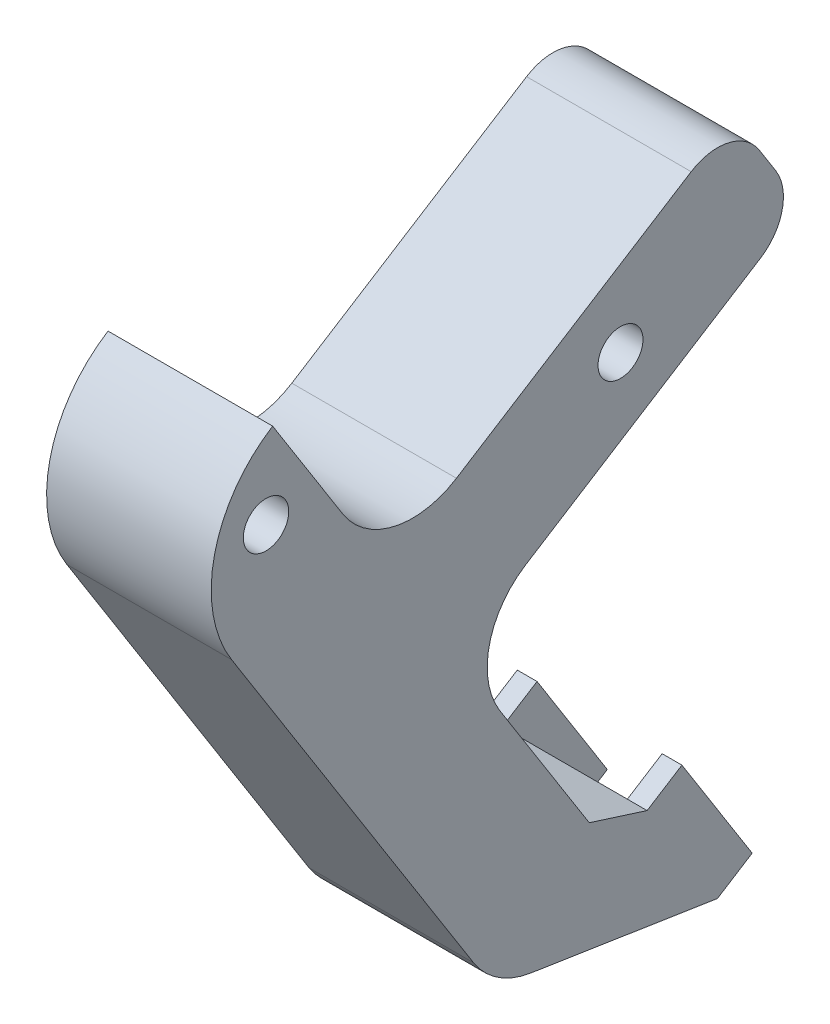
ISO-10303-21;
HEADER;
FILE_DESCRIPTION(('STEP AP214'),'2;1');
FILE_NAME('part.step','',(''),(''),'','','');
FILE_SCHEMA(('AUTOMOTIVE_DESIGN { 1 0 10303 214 1 1 1 1 }'));
ENDSEC;
DATA;
#1=APPLICATION_CONTEXT('core data for automotive mechanical design processes');
#2=APPLICATION_PROTOCOL_DEFINITION('international standard','automotive_design',2000,#1);
#3=PRODUCT_CONTEXT('',#1,'mechanical');
#4=PRODUCT('Part','Part','',(#3));
#5=PRODUCT_RELATED_PRODUCT_CATEGORY('part','',(#4));
#6=PRODUCT_DEFINITION_FORMATION('','',#4);
#7=PRODUCT_DEFINITION_CONTEXT('part definition',#1,'design');
#8=PRODUCT_DEFINITION('design','',#6,#7);
#9=PRODUCT_DEFINITION_SHAPE('','',#8);
#10=(LENGTH_UNIT() NAMED_UNIT(*) SI_UNIT(.MILLI.,.METRE.));
#11=(NAMED_UNIT(*) PLANE_ANGLE_UNIT() SI_UNIT($,.RADIAN.));
#12=(NAMED_UNIT(*) SI_UNIT($,.STERADIAN.) SOLID_ANGLE_UNIT());
#13=UNCERTAINTY_MEASURE_WITH_UNIT(LENGTH_MEASURE(1.E-05),#10,'distance_accuracy_value','');
#14=(GEOMETRIC_REPRESENTATION_CONTEXT(3) GLOBAL_UNCERTAINTY_ASSIGNED_CONTEXT((#13)) GLOBAL_UNIT_ASSIGNED_CONTEXT((#10,
#11,#12)) REPRESENTATION_CONTEXT('',''));
#15=CARTESIAN_POINT('',(0.,0.,0.));
#16=DIRECTION('',(0.,0.,1.));
#17=DIRECTION('',(1.,0.,0.));
#18=AXIS2_PLACEMENT_3D('',#15,#16,#17);
#19=CARTESIAN_POINT('',(-6.35000000000044,13860.4244470789,11803.2346085107));
#20=DIRECTION('',(0.,0.533629298072643,-0.845718494676862));
#21=DIRECTION('',(0.,0.845718494676863,0.533629298072643));
#22=AXIS2_PLACEMENT_3D('',#19,#20,#21);
#23=PLANE('',#22);
#24=DIRECTION('',(1.,0.,0.));
#25=VECTOR('',#24,1.);
#26=CARTESIAN_POINT('',(-6.35000000000044,13851.8319471729,11797.8129348422));
#27=LINE('',#26,#25);
#28=CARTESIAN_POINT('',(-4.82600000000044,13851.8319471729,11797.8129348422));
#29=VERTEX_POINT('',#28);
#30=CARTESIAN_POINT('',(4.8259999999995,13851.8319471729,11797.8129348422));
#31=VERTEX_POINT('',#30);
#32=EDGE_CURVE('E63',#29,#31,#27,.T.);
#33=ORIENTED_EDGE('',*,*,#32,.F.);
#34=DIRECTION('',(0.,-0.845718494676862,-0.533629298072643));
#35=VECTOR('',#34,1.);
#36=CARTESIAN_POINT('',(-4.82600000000044,-1379.90412378005,2186.93096982616));
#37=LINE('',#36,#35);
#38=CARTESIAN_POINT('',(-4.82600000000044,13860.4244470789,11803.2346085107));
#39=VERTEX_POINT('',#38);
#40=EDGE_CURVE('E58',#39,#29,#37,.T.);
#41=ORIENTED_EDGE('',*,*,#40,.F.);
#42=DIRECTION('',(1.,0.,0.));
#43=VECTOR('',#42,1.);
#44=CARTESIAN_POINT('',(-6.35000000000044,13860.4244470789,11803.2346085107));
#45=LINE('',#44,#43);
#46=CARTESIAN_POINT('',(4.82599999999955,13860.4244470789,11803.2346085107));
#47=VERTEX_POINT('',#46);
#48=EDGE_CURVE('E346',#39,#47,#45,.T.);
#49=ORIENTED_EDGE('',*,*,#48,.T.);
#50=DIRECTION('',(0.,-0.845718494676862,-0.533629298072643));
#51=VECTOR('',#50,1.);
#52=CARTESIAN_POINT('',(4.82600000000949,-1379.90412378005,2186.93096982616));
#53=LINE('',#52,#51);
#54=EDGE_CURVE('E206',#47,#31,#53,.T.);
#55=ORIENTED_EDGE('',*,*,#54,.T.);
#56=EDGE_LOOP('',(#33,#41,#49,#55));
#57=FACE_BOUND('',#56,.T.);
#58=ADVANCED_FACE('F43',(#57),#23,.T.);
#59=CARTESIAN_POINT('',(-6.35000000000044,13851.8319471729,11797.8129348422));
#60=DIRECTION('',(0.,-0.988269978959447,0.152716890642436));
#61=DIRECTION('',(0.,-0.152716890642436,-0.988269978959447));
#62=AXIS2_PLACEMENT_3D('',#59,#60,#61);
#63=PLANE('',#62);
#64=CARTESIAN_POINT('',(-6.35000000000044,13851.8319471729,11797.8129348422));
#65=VERTEX_POINT('',#64);
#66=EDGE_CURVE('E347',#65,#29,#27,.T.);
#67=ORIENTED_EDGE('',*,*,#66,.T.);
#68=ORIENTED_EDGE('',*,*,#32,.T.);
#69=DIRECTION('',(-1.,0.,0.));
#70=VECTOR('',#69,1.);
#71=CARTESIAN_POINT('',(0.,13851.8319471729,11797.8129348422));
#72=LINE('',#71,#70);
#73=CARTESIAN_POINT('',(6.34999999999956,13851.8319471729,11797.8129348422));
#74=VERTEX_POINT('',#73);
#75=EDGE_CURVE('E218',#74,#31,#72,.T.);
#76=ORIENTED_EDGE('',*,*,#75,.F.);
#77=DIRECTION('',(0.,-0.152716890642436,-0.988269978959447));
#78=VECTOR('',#77,1.);
#79=CARTESIAN_POINT('',(6.34999999999956,13851.8319471729,11797.8129348422));
#80=LINE('',#79,#78);
#81=CARTESIAN_POINT('',(6.34999999999956,13854.0582362241,11812.2198195323));
#82=VERTEX_POINT('',#81);
#83=EDGE_CURVE('E241',#82,#74,#80,.T.);
#84=ORIENTED_EDGE('',*,*,#83,.F.);
#85=DIRECTION('',(1.,0.,0.));
#86=VECTOR('',#85,1.);
#87=CARTESIAN_POINT('',(-6.35000000000044,13854.0582362241,11812.2198195323));
#88=LINE('',#87,#86);
#89=CARTESIAN_POINT('',(-6.35000000000044,13854.0582362241,11812.2198195323));
#90=VERTEX_POINT('',#89);
#91=EDGE_CURVE('E316',#90,#82,#88,.T.);
#92=ORIENTED_EDGE('',*,*,#91,.F.);
#93=DIRECTION('',(0.,-0.152716890642436,-0.988269978959447));
#94=VECTOR('',#93,1.);
#95=CARTESIAN_POINT('',(-6.35000000000044,13851.8319471729,11797.8129348422));
#96=LINE('',#95,#94);
#97=EDGE_CURVE('E282',#90,#65,#96,.T.);
#98=ORIENTED_EDGE('',*,*,#97,.T.);
#99=EDGE_LOOP('',(#67,#68,#76,#84,#92,#98));
#100=FACE_BOUND('',#99,.T.);
#101=ADVANCED_FACE('F442',(#100),#63,.T.);
#102=CARTESIAN_POINT('',(-6.35000000000044,13860.3337505905,11811.2500672767));
#103=DIRECTION('',(1.,0.,0.));
#104=DIRECTION('',(0.,0.,-1.));
#105=AXIS2_PLACEMENT_3D('',#102,#103,#104);
#106=CYLINDRICAL_SURFACE('',#105,6.35000000000063);
#107=ORIENTED_EDGE('',*,*,#91,.T.);
#108=CARTESIAN_POINT('',(6.34999999999956,13860.3337505905,11811.2500672767));
#109=DIRECTION('',(1.,0.,0.));
#110=DIRECTION('',(0.,0.,1.));
#111=AXIS2_PLACEMENT_3D('',#108,#109,#110);
#112=CIRCLE('',#111,6.35000000000063);
#113=CARTESIAN_POINT('',(6.34999999999956,13856.9452045477,11816.6203797179));
#114=VERTEX_POINT('',#113);
#115=EDGE_CURVE('E276',#114,#82,#112,.T.);
#116=ORIENTED_EDGE('',*,*,#115,.F.);
#117=DIRECTION('',(1.,0.,0.));
#118=VECTOR('',#117,1.);
#119=CARTESIAN_POINT('',(-6.35000000000044,13856.9452045477,11816.6203797179));
#120=LINE('',#119,#118);
#121=CARTESIAN_POINT('',(-6.35000000000044,13856.9452045477,11816.6203797179));
#122=VERTEX_POINT('',#121);
#123=EDGE_CURVE('E319',#122,#114,#120,.T.);
#124=ORIENTED_EDGE('',*,*,#123,.F.);
#125=CARTESIAN_POINT('',(-6.35000000000044,13860.3337505905,11811.2500672767));
#126=DIRECTION('',(1.,0.,0.));
#127=DIRECTION('',(0.,0.,1.));
#128=AXIS2_PLACEMENT_3D('',#125,#126,#127);
#129=CIRCLE('',#128,6.35000000000063);
#130=EDGE_CURVE('E313',#122,#90,#129,.T.);
#131=ORIENTED_EDGE('',*,*,#130,.T.);
#132=EDGE_LOOP('',(#107,#116,#124,#131));
#133=FACE_BOUND('',#132,.T.);
#134=ADVANCED_FACE('F447',(#133),#106,.T.);
#135=CARTESIAN_POINT('',(-6.35000000000044,13856.9452045477,11816.6203797179));
#136=DIRECTION('',(0.,-0.53362929807185,0.845718494677363));
#137=DIRECTION('',(0.,-0.845718494677363,-0.53362929807185));
#138=AXIS2_PLACEMENT_3D('',#135,#136,#137);
#139=PLANE('',#138);
#140=DIRECTION('',(0.,-0.845718494677363,-0.53362929807185));
#141=VECTOR('',#140,1.);
#142=CARTESIAN_POINT('',(6.34999999999956,13856.9452045477,11816.6203797179));
#143=LINE('',#142,#141);
#144=CARTESIAN_POINT('',(6.34999999999956,13886.5392189318,11835.2935354101));
#145=VERTEX_POINT('',#144);
#146=EDGE_CURVE('E274',#145,#114,#143,.T.);
#147=ORIENTED_EDGE('',*,*,#146,.F.);
#148=DIRECTION('',(1.,0.,0.));
#149=VECTOR('',#148,1.);
#150=CARTESIAN_POINT('',(-6.35000000000044,13886.5392189318,11835.2935354101));
#151=LINE('',#150,#149);
#152=CARTESIAN_POINT('',(-6.35000000000044,13886.5392189318,11835.2935354101));
#153=VERTEX_POINT('',#152);
#154=EDGE_CURVE('E51',#145,#153,#151,.F.);
#155=ORIENTED_EDGE('',*,*,#154,.T.);
#156=DIRECTION('',(0.,-0.845718494677363,-0.53362929807185));
#157=VECTOR('',#156,1.);
#158=CARTESIAN_POINT('',(-6.35000000000044,13856.9452045477,11816.6203797179));
#159=LINE('',#158,#157);
#160=EDGE_CURVE('E311',#153,#122,#159,.T.);
#161=ORIENTED_EDGE('',*,*,#160,.T.);
#162=ORIENTED_EDGE('',*,*,#123,.T.);
#163=EDGE_LOOP('',(#147,#155,#161,#162));
#164=FACE_BOUND('',#163,.T.);
#165=ADVANCED_FACE('F353',(#164),#139,.T.);
#166=CARTESIAN_POINT('',(-6.35000000000044,13900.5533925062,11832.1227091726));
#167=DIRECTION('',(0.,0.533629298071824,-0.845718494677379));
#168=DIRECTION('',(0.,0.845718494677379,0.533629298071824));
#169=AXIS2_PLACEMENT_3D('',#166,#167,#168);
#170=PLANE('',#169);
#171=DIRECTION('',(1.,0.,0.));
#172=VECTOR('',#171,1.);
#173=CARTESIAN_POINT('',(-6.35000000000044,13900.5533925062,11832.1227091726));
#174=LINE('',#173,#172);
#175=CARTESIAN_POINT('',(-6.35000000000044,13900.5533925062,11832.1227091726));
#176=VERTEX_POINT('',#175);
#177=CARTESIAN_POINT('',(6.34999999999956,13900.5533925062,11832.1227091726));
#178=VERTEX_POINT('',#177);
#179=EDGE_CURVE('E322',#176,#178,#174,.T.);
#180=ORIENTED_EDGE('',*,*,#179,.T.);
#181=DIRECTION('',(0.,0.845718494677379,0.533629298071824));
#182=VECTOR('',#181,1.);
#183=CARTESIAN_POINT('',(6.34999999999956,13900.5533925062,11832.1227091726));
#184=LINE('',#183,#182);
#185=CARTESIAN_POINT('',(6.34999999999956,13891.963426384,11826.7026342646));
#186=VERTEX_POINT('',#185);
#187=EDGE_CURVE('E271',#186,#178,#184,.T.);
#188=ORIENTED_EDGE('',*,*,#187,.F.);
#189=DIRECTION('',(1.,0.,0.));
#190=VECTOR('',#189,1.);
#191=CARTESIAN_POINT('',(-6.35000000000044,13891.963426384,11826.7026342646));
#192=LINE('',#191,#190);
#193=CARTESIAN_POINT('',(-6.35000000000044,13891.963426384,11826.7026342646));
#194=VERTEX_POINT('',#193);
#195=EDGE_CURVE('E325',#194,#186,#192,.T.);
#196=ORIENTED_EDGE('',*,*,#195,.F.);
#197=DIRECTION('',(0.,0.845718494677379,0.533629298071824));
#198=VECTOR('',#197,1.);
#199=CARTESIAN_POINT('',(-6.35000000000044,13900.5533925062,11832.1227091726));
#200=LINE('',#199,#198);
#201=EDGE_CURVE('E308',#194,#176,#200,.T.);
#202=ORIENTED_EDGE('',*,*,#201,.T.);
#203=EDGE_LOOP('',(#180,#188,#196,#202));
#204=FACE_BOUND('',#203,.T.);
#205=ADVANCED_FACE('F365',(#204),#170,.T.);
#206=CARTESIAN_POINT('',(-6.35000000000044,13895.3519724267,11821.3323218234));
#207=DIRECTION('',(1.,0.,0.));
#208=DIRECTION('',(0.,0.,-1.));
#209=AXIS2_PLACEMENT_3D('',#206,#207,#208);
#210=CYLINDRICAL_SURFACE('',#209,6.3499999999997);
#211=ORIENTED_EDGE('',*,*,#195,.T.);
#212=CARTESIAN_POINT('',(6.34999999999956,13895.3519724267,11821.3323218234));
#213=DIRECTION('',(-1.,0.,0.));
#214=DIRECTION('',(0.,0.,-1.));
#215=AXIS2_PLACEMENT_3D('',#212,#213,#214);
#216=CIRCLE('',#215,6.3499999999997);
#217=CARTESIAN_POINT('',(6.34999999999956,13889.9816599855,11817.9437757806));
#218=VERTEX_POINT('',#217);
#219=EDGE_CURVE('E268',#218,#186,#216,.T.);
#220=ORIENTED_EDGE('',*,*,#219,.F.);
#221=DIRECTION('',(1.,0.,0.));
#222=VECTOR('',#221,1.);
#223=CARTESIAN_POINT('',(-6.35000000000044,13889.9816599855,11817.9437757806));
#224=LINE('',#223,#222);
#225=CARTESIAN_POINT('',(-6.35000000000044,13889.9816599855,11817.9437757806));
#226=VERTEX_POINT('',#225);
#227=EDGE_CURVE('E327',#226,#218,#224,.T.);
#228=ORIENTED_EDGE('',*,*,#227,.F.);
#229=CARTESIAN_POINT('',(-6.35000000000044,13895.3519724267,11821.3323218234));
#230=DIRECTION('',(-1.,0.,0.));
#231=DIRECTION('',(0.,0.,-1.));
#232=AXIS2_PLACEMENT_3D('',#229,#230,#231);
#233=CIRCLE('',#232,6.3499999999997);
#234=EDGE_CURVE('E305',#226,#194,#233,.T.);
#235=ORIENTED_EDGE('',*,*,#234,.T.);
#236=EDGE_LOOP('',(#211,#220,#228,#235));
#237=FACE_BOUND('',#236,.T.);
#238=ADVANCED_FACE('F373',(#237),#210,.F.);
#239=CARTESIAN_POINT('',(-6.35000000000044,13889.9816599855,11817.9437757806));
#240=DIRECTION('',(0.,0.845718494677432,0.533629298071741));
#241=DIRECTION('',(0.,-0.533629298071741,0.845718494677432));
#242=AXIS2_PLACEMENT_3D('',#239,#240,#241);
#243=PLANE('',#242);
#244=ORIENTED_EDGE('',*,*,#227,.T.);
#245=DIRECTION('',(0.,-0.533629298071882,0.845718494677342));
#246=VECTOR('',#245,1.);
#247=CARTESIAN_POINT('',(6.34999999999956,13901.4081937856,11799.8345171629));
#248=LINE('',#247,#246);
#249=CARTESIAN_POINT('',(6.34999999999956,13901.4081937856,11799.8345171629));
#250=VERTEX_POINT('',#249);
#251=EDGE_CURVE('E265',#250,#218,#248,.T.);
#252=ORIENTED_EDGE('',*,*,#251,.F.);
#253=DIRECTION('',(1.,0.,0.));
#254=VECTOR('',#253,1.);
#255=CARTESIAN_POINT('',(-6.35000000000044,13901.4081937856,11799.8345171629));
#256=LINE('',#255,#254);
#257=CARTESIAN_POINT('',(-6.35000000000044,13901.4081937856,11799.8345171629));
#258=VERTEX_POINT('',#257);
#259=EDGE_CURVE('E329',#258,#250,#256,.T.);
#260=ORIENTED_EDGE('',*,*,#259,.F.);
#261=DIRECTION('',(0.,-0.533629298071882,0.845718494677342));
#262=VECTOR('',#261,1.);
#263=CARTESIAN_POINT('',(-6.35000000000044,13901.4081937856,11799.8345171629));
#264=LINE('',#263,#262);
#265=EDGE_CURVE('E303',#258,#226,#264,.T.);
#266=ORIENTED_EDGE('',*,*,#265,.T.);
#267=EDGE_LOOP('',(#244,#252,#260,#266));
#268=FACE_BOUND('',#267,.T.);
#269=ADVANCED_FACE('F465',(#268),#243,.T.);
#270=CARTESIAN_POINT('',(-6.35000000000044,13898.1860063209,11797.8013895372));
#271=DIRECTION('',(1.,0.,0.));
#272=DIRECTION('',(0.,0.,-1.));
#273=AXIS2_PLACEMENT_3D('',#270,#271,#272);
#274=CYLINDRICAL_SURFACE('',#273,3.80999999999998);
#275=ORIENTED_EDGE('',*,*,#259,.T.);
#276=CARTESIAN_POINT('',(6.34999999999956,13898.1860063209,11797.8013895372));
#277=DIRECTION('',(1.,0.,0.));
#278=DIRECTION('',(0.,0.,1.));
#279=AXIS2_PLACEMENT_3D('',#276,#277,#278);
#280=CIRCLE('',#279,3.80999999999998);
#281=CARTESIAN_POINT('',(6.34999999999956,13900.2191339465,11794.5792020725));
#282=VERTEX_POINT('',#281);
#283=EDGE_CURVE('E262',#282,#250,#280,.T.);
#284=ORIENTED_EDGE('',*,*,#283,.F.);
#285=DIRECTION('',(1.,0.,0.));
#286=VECTOR('',#285,1.);
#287=CARTESIAN_POINT('',(-6.35000000000044,13900.2191339465,11794.5792020725));
#288=LINE('',#287,#286);
#289=CARTESIAN_POINT('',(-6.35000000000044,13900.2191339465,11794.5792020725));
#290=VERTEX_POINT('',#289);
#291=EDGE_CURVE('E331',#290,#282,#288,.T.);
#292=ORIENTED_EDGE('',*,*,#291,.F.);
#293=CARTESIAN_POINT('',(-6.35000000000044,13898.1860063209,11797.8013895372));
#294=DIRECTION('',(1.,0.,0.));
#295=DIRECTION('',(0.,0.,1.));
#296=AXIS2_PLACEMENT_3D('',#293,#294,#295);
#297=CIRCLE('',#296,3.80999999999998);
#298=EDGE_CURVE('E300',#290,#258,#297,.T.);
#299=ORIENTED_EDGE('',*,*,#298,.T.);
#300=EDGE_LOOP('',(#275,#284,#292,#299));
#301=FACE_BOUND('',#300,.T.);
#302=ADVANCED_FACE('F380',(#301),#274,.T.);
#303=CARTESIAN_POINT('',(-6.35000000000044,13898.2050939484,11793.3083882529));
#304=DIRECTION('',(0.,0.533629298071468,-0.845718494677604));
#305=DIRECTION('',(0.,0.845718494677604,0.533629298071468));
#306=AXIS2_PLACEMENT_3D('',#303,#304,#305);
#307=PLANE('',#306);
#308=ORIENTED_EDGE('',*,*,#291,.T.);
#309=DIRECTION('',(0.,0.845718494677604,0.533629298071468));
#310=VECTOR('',#309,1.);
#311=CARTESIAN_POINT('',(6.34999999999956,13898.2050939484,11793.3083882529));
#312=LINE('',#311,#310);
#313=CARTESIAN_POINT('',(6.34999999999956,13898.2050939484,11793.3083882529));
#314=VERTEX_POINT('',#313);
#315=EDGE_CURVE('E259',#314,#282,#312,.T.);
#316=ORIENTED_EDGE('',*,*,#315,.F.);
#317=DIRECTION('',(1.,0.,0.));
#318=VECTOR('',#317,1.);
#319=CARTESIAN_POINT('',(-6.35000000000044,13898.2050939484,11793.3083882529));
#320=LINE('',#319,#318);
#321=CARTESIAN_POINT('',(-6.35000000000044,13898.2050939484,11793.3083882529));
#322=VERTEX_POINT('',#321);
#323=EDGE_CURVE('E333',#322,#314,#320,.T.);
#324=ORIENTED_EDGE('',*,*,#323,.F.);
#325=DIRECTION('',(0.,0.845718494677604,0.533629298071468));
#326=VECTOR('',#325,1.);
#327=CARTESIAN_POINT('',(-6.35000000000044,13898.2050939484,11793.3083882529));
#328=LINE('',#327,#326);
#329=EDGE_CURVE('E297',#322,#290,#328,.T.);
#330=ORIENTED_EDGE('',*,*,#329,.T.);
#331=EDGE_LOOP('',(#308,#316,#324,#330));
#332=FACE_BOUND('',#331,.T.);
#333=ADVANCED_FACE('F384',(#332),#307,.T.);
#334=CARTESIAN_POINT('',(-6.35000000000044,13896.1719663227,11796.5305757176));
#335=DIRECTION('',(1.,0.,0.));
#336=DIRECTION('',(0.,0.,-1.));
#337=AXIS2_PLACEMENT_3D('',#334,#335,#336);
#338=CYLINDRICAL_SURFACE('',#337,3.80999999999923);
#339=ORIENTED_EDGE('',*,*,#323,.T.);
#340=CARTESIAN_POINT('',(6.34999999999956,13896.1719663227,11796.5305757176));
#341=DIRECTION('',(1.,0.,0.));
#342=DIRECTION('',(0.,0.,-1.));
#343=AXIS2_PLACEMENT_3D('',#340,#341,#342);
#344=CIRCLE('',#343,3.80999999999923);
#345=CARTESIAN_POINT('',(6.34999999999956,13892.949778858,11794.497448092));
#346=VERTEX_POINT('',#345);
#347=EDGE_CURVE('E256',#346,#314,#344,.T.);
#348=ORIENTED_EDGE('',*,*,#347,.F.);
#349=DIRECTION('',(1.,0.,0.));
#350=VECTOR('',#349,1.);
#351=CARTESIAN_POINT('',(-6.35000000000044,13892.949778858,11794.497448092));
#352=LINE('',#351,#350);
#353=CARTESIAN_POINT('',(-6.35000000000044,13892.949778858,11794.497448092));
#354=VERTEX_POINT('',#353);
#355=EDGE_CURVE('E335',#354,#346,#352,.T.);
#356=ORIENTED_EDGE('',*,*,#355,.F.);
#357=CARTESIAN_POINT('',(-6.35000000000044,13896.1719663227,11796.5305757176));
#358=DIRECTION('',(1.,0.,0.));
#359=DIRECTION('',(0.,0.,-1.));
#360=AXIS2_PLACEMENT_3D('',#357,#358,#359);
#361=CIRCLE('',#360,3.80999999999923);
#362=EDGE_CURVE('E294',#354,#322,#361,.T.);
#363=ORIENTED_EDGE('',*,*,#362,.T.);
#364=EDGE_LOOP('',(#339,#348,#356,#363));
#365=FACE_BOUND('',#364,.T.);
#366=ADVANCED_FACE('F389',(#365),#338,.T.);
#367=CARTESIAN_POINT('',(-6.35000000000044,13885.0820969765,11806.9664862454));
#368=DIRECTION('',(0.,-0.845718494677343,-0.533629298071883));
#369=DIRECTION('',(0.,0.533629298071883,-0.845718494677343));
#370=AXIS2_PLACEMENT_3D('',#367,#368,#369);
#371=PLANE('',#370);
#372=ORIENTED_EDGE('',*,*,#355,.T.);
#373=DIRECTION('',(0.,0.533629298071741,-0.845718494677432));
#374=VECTOR('',#373,1.);
#375=CARTESIAN_POINT('',(6.34999999999956,13881.5232450579,11812.6067067097));
#376=LINE('',#375,#374);
#377=CARTESIAN_POINT('',(6.34999999999956,13881.5232450579,11812.6067067097));
#378=VERTEX_POINT('',#377);
#379=EDGE_CURVE('E253',#378,#346,#376,.T.);
#380=ORIENTED_EDGE('',*,*,#379,.F.);
#381=DIRECTION('',(1.,0.,0.));
#382=VECTOR('',#381,1.);
#383=CARTESIAN_POINT('',(-6.35000000000044,13881.5232450579,11812.6067067097));
#384=LINE('',#383,#382);
#385=CARTESIAN_POINT('',(-6.35000000000044,13881.5232450579,11812.6067067097));
#386=VERTEX_POINT('',#385);
#387=EDGE_CURVE('E337',#386,#378,#384,.T.);
#388=ORIENTED_EDGE('',*,*,#387,.F.);
#389=DIRECTION('',(0.,0.533629298071741,-0.845718494677432));
#390=VECTOR('',#389,1.);
#391=CARTESIAN_POINT('',(-6.35000000000044,13881.5232450579,11812.6067067097));
#392=LINE('',#391,#390);
#393=EDGE_CURVE('E292',#386,#354,#392,.T.);
#394=ORIENTED_EDGE('',*,*,#393,.T.);
#395=EDGE_LOOP('',(#372,#380,#388,#394));
#396=FACE_BOUND('',#395,.T.);
#397=ADVANCED_FACE('F456',(#396),#371,.T.);
#398=CARTESIAN_POINT('',(-6.35000000000044,13876.1529326167,11809.218160667));
#399=DIRECTION('',(1.,0.,0.));
#400=DIRECTION('',(0.,0.,-1.));
#401=AXIS2_PLACEMENT_3D('',#398,#399,#400);
#402=CYLINDRICAL_SURFACE('',#401,6.35000000000045);
#403=ORIENTED_EDGE('',*,*,#387,.T.);
#404=CARTESIAN_POINT('',(6.34999999999956,13876.1529326167,11809.218160667));
#405=DIRECTION('',(-1.,0.,0.));
#406=DIRECTION('',(0.,0.,-1.));
#407=AXIS2_PLACEMENT_3D('',#404,#405,#406);
#408=CIRCLE('',#407,6.35000000000045);
#409=CARTESIAN_POINT('',(6.34999999999956,13872.7643865739,11814.5884731082));
#410=VERTEX_POINT('',#409);
#411=EDGE_CURVE('E250',#410,#378,#408,.T.);
#412=ORIENTED_EDGE('',*,*,#411,.F.);
#413=DIRECTION('',(1.,0.,0.));
#414=VECTOR('',#413,1.);
#415=CARTESIAN_POINT('',(-6.35000000000044,13872.7643865739,11814.5884731082));
#416=LINE('',#415,#414);
#417=CARTESIAN_POINT('',(-6.35000000000044,13872.7643865739,11814.5884731082));
#418=VERTEX_POINT('',#417);
#419=EDGE_CURVE('E339',#418,#410,#416,.T.);
#420=ORIENTED_EDGE('',*,*,#419,.F.);
#421=CARTESIAN_POINT('',(-6.35000000000044,13876.1529326167,11809.218160667));
#422=DIRECTION('',(-1.,0.,0.));
#423=DIRECTION('',(0.,0.,-1.));
#424=AXIS2_PLACEMENT_3D('',#421,#422,#423);
#425=CIRCLE('',#424,6.35000000000045);
#426=EDGE_CURVE('E289',#418,#386,#425,.T.);
#427=ORIENTED_EDGE('',*,*,#426,.T.);
#428=EDGE_LOOP('',(#403,#412,#420,#427));
#429=FACE_BOUND('',#428,.T.);
#430=ADVANCED_FACE('F396',(#429),#402,.F.);
#431=CARTESIAN_POINT('',(-6.35000000000044,13861.8411178284,11807.6961368639));
#432=DIRECTION('',(0.,0.533629298071706,-0.845718494677454));
#433=DIRECTION('',(0.,0.845718494677454,0.533629298071706));
#434=AXIS2_PLACEMENT_3D('',#431,#432,#433);
#435=PLANE('',#434);
#436=ORIENTED_EDGE('',*,*,#419,.T.);
#437=DIRECTION('',(0.,0.845718494677454,0.533629298071706));
#438=VECTOR('',#437,1.);
#439=CARTESIAN_POINT('',(6.34999999999956,13861.8411178284,11807.6961368639));
#440=LINE('',#439,#438);
#441=CARTESIAN_POINT('',(6.34999999999956,13861.8411178284,11807.6961368639));
#442=VERTEX_POINT('',#441);
#443=EDGE_CURVE('E247',#442,#410,#440,.T.);
#444=ORIENTED_EDGE('',*,*,#443,.F.);
#445=DIRECTION('',(1.,0.,0.));
#446=VECTOR('',#445,1.);
#447=CARTESIAN_POINT('',(-6.35000000000044,13861.8411178284,11807.6961368639));
#448=LINE('',#447,#446);
#449=CARTESIAN_POINT('',(-6.35000000000044,13861.8411178284,11807.6961368639));
#450=VERTEX_POINT('',#449);
#451=EDGE_CURVE('E341',#450,#442,#448,.T.);
#452=ORIENTED_EDGE('',*,*,#451,.F.);
#453=DIRECTION('',(0.,0.845718494677454,0.533629298071706));
#454=VECTOR('',#453,1.);
#455=CARTESIAN_POINT('',(-6.35000000000044,13861.8411178284,11807.6961368639));
#456=LINE('',#455,#454);
#457=EDGE_CURVE('E286',#450,#418,#456,.T.);
#458=ORIENTED_EDGE('',*,*,#457,.T.);
#459=EDGE_LOOP('',(#436,#444,#452,#458));
#460=FACE_BOUND('',#459,.T.);
#461=ADVANCED_FACE('F400',(#460),#435,.T.);
#462=CARTESIAN_POINT('',(-6.35000000000044,13860.8456393668,11804.5610715122));
#463=DIRECTION('',(0.,0.953105009743497,-0.302639786548048));
#464=DIRECTION('',(0.,0.302639786548048,0.953105009743497));
#465=AXIS2_PLACEMENT_3D('',#462,#463,#464);
#466=PLANE('',#465);
#467=ORIENTED_EDGE('',*,*,#451,.T.);
#468=DIRECTION('',(0.,0.302639786547993,0.953105009743515));
#469=VECTOR('',#468,1.);
#470=CARTESIAN_POINT('',(6.34999999999956,13860.8456393668,11804.5610715122));
#471=LINE('',#470,#469);
#472=CARTESIAN_POINT('',(6.34999999999956,13860.4244470789,11803.2346085107));
#473=VERTEX_POINT('',#472);
#474=EDGE_CURVE('E244',#473,#442,#471,.T.);
#475=ORIENTED_EDGE('',*,*,#474,.F.);
#476=DIRECTION('',(1.,0.,0.));
#477=VECTOR('',#476,1.);
#478=CARTESIAN_POINT('',(0.,13860.4244470789,11803.2346085107));
#479=LINE('',#478,#477);
#480=EDGE_CURVE('E208',#47,#473,#479,.T.);
#481=ORIENTED_EDGE('',*,*,#480,.F.);
#482=ORIENTED_EDGE('',*,*,#48,.F.);
#483=CARTESIAN_POINT('',(-6.35000000000044,13860.4244470789,11803.2346085107));
#484=VERTEX_POINT('',#483);
#485=EDGE_CURVE('E343',#484,#39,#45,.T.);
#486=ORIENTED_EDGE('',*,*,#485,.F.);
#487=DIRECTION('',(0.,0.302639786547993,0.953105009743515));
#488=VECTOR('',#487,1.);
#489=CARTESIAN_POINT('',(-6.35000000000044,13860.8456393668,11804.5610715122));
#490=LINE('',#489,#488);
#491=EDGE_CURVE('E284',#484,#450,#490,.T.);
#492=ORIENTED_EDGE('',*,*,#491,.T.);
#493=EDGE_LOOP('',(#467,#475,#481,#482,#486,#492));
#494=FACE_BOUND('',#493,.T.);
#495=ADVANCED_FACE('F407',(#494),#466,.T.);
#496=CARTESIAN_POINT('',(-6.35000000000044,13860.3337505905,11811.2500672767));
#497=DIRECTION('',(-1.,0.,0.));
#498=DIRECTION('',(0.,0.,1.));
#499=AXIS2_PLACEMENT_3D('',#496,#497,#498);
#500=PLANE('',#499);
#501=CARTESIAN_POINT('',(-6.35000000000044,13894.2252818194,11832.6348591833));
#502=DIRECTION('',(-1.,0.,0.));
#503=DIRECTION('',(0.,0.,1.));
#504=AXIS2_PLACEMENT_3D('',#501,#502,#503);
#505=CIRCLE('',#504,1.75260000000006);
#506=CARTESIAN_POINT('',(-6.35000000000044,13894.2252818194,11834.3874591833));
#507=VERTEX_POINT('',#506);
#508=EDGE_CURVE('E417',#507,#507,#505,.T.);
#509=ORIENTED_EDGE('',*,*,#508,.F.);
#510=EDGE_LOOP('',(#509));
#511=FACE_BOUND('',#510,.T.);
#512=CARTESIAN_POINT('',(-6.35000000000044,13892.0545051981,11805.2874790999));
#513=DIRECTION('',(1.,0.,0.));
#514=DIRECTION('',(0.,0.,-1.));
#515=AXIS2_PLACEMENT_3D('',#512,#513,#514);
#516=CIRCLE('',#515,1.73388063273676);
#517=CARTESIAN_POINT('',(-6.35000000000044,13892.0545051981,11803.5535984672));
#518=VERTEX_POINT('',#517);
#519=EDGE_CURVE('E279',#518,#518,#516,.T.);
#520=ORIENTED_EDGE('',*,*,#519,.T.);
#521=EDGE_LOOP('',(#520));
#522=FACE_BOUND('',#521,.T.);
#523=ORIENTED_EDGE('',*,*,#160,.F.);
#524=CARTESIAN_POINT('',(-6.35000000000044,13891.9608926002,11826.7010355042));
#525=DIRECTION('',(-1.,0.,0.));
#526=DIRECTION('',(0.,0.,1.));
#527=AXIS2_PLACEMENT_3D('',#524,#525,#526);
#528=CIRCLE('',#527,10.16);
#529=EDGE_CURVE('E11',#153,#176,#528,.T.);
#530=ORIENTED_EDGE('',*,*,#529,.T.);
#531=ORIENTED_EDGE('',*,*,#201,.F.);
#532=ORIENTED_EDGE('',*,*,#234,.F.);
#533=ORIENTED_EDGE('',*,*,#265,.F.);
#534=ORIENTED_EDGE('',*,*,#298,.F.);
#535=ORIENTED_EDGE('',*,*,#329,.F.);
#536=ORIENTED_EDGE('',*,*,#362,.F.);
#537=ORIENTED_EDGE('',*,*,#393,.F.);
#538=ORIENTED_EDGE('',*,*,#426,.F.);
#539=ORIENTED_EDGE('',*,*,#457,.F.);
#540=ORIENTED_EDGE('',*,*,#491,.F.);
#541=DIRECTION('',(0.,-0.533629298072643,0.845718494676862));
#542=VECTOR('',#541,1.);
#543=CARTESIAN_POINT('',(-6.35000000000044,13862.1187201002,11800.5494522901));
#544=LINE('',#543,#542);
#545=CARTESIAN_POINT('',(-6.35000000000044,13862.1187201002,11800.5494522901));
#546=VERTEX_POINT('',#545);
#547=EDGE_CURVE('E210',#546,#484,#544,.T.);
#548=ORIENTED_EDGE('',*,*,#547,.F.);
#549=DIRECTION('',(0.,0.845718494676862,0.533629298072643));
#550=VECTOR('',#549,1.);
#551=CARTESIAN_POINT('',(-6.35000000000044,-1378.20985075867,2184.24581360556));
#552=LINE('',#551,#550);
#553=CARTESIAN_POINT('',(-6.35000000000044,13853.5262201943,11795.1277786216));
#554=VERTEX_POINT('',#553);
#555=EDGE_CURVE('E194',#554,#546,#552,.T.);
#556=ORIENTED_EDGE('',*,*,#555,.F.);
#557=DIRECTION('',(0.,-0.533629298072643,0.845718494676862));
#558=VECTOR('',#557,1.);
#559=CARTESIAN_POINT('',(-6.35000000000044,13853.5262201943,11795.1277786216));
#560=LINE('',#559,#558);
#561=EDGE_CURVE('E191',#554,#65,#560,.T.);
#562=ORIENTED_EDGE('',*,*,#561,.T.);
#563=ORIENTED_EDGE('',*,*,#97,.F.);
#564=ORIENTED_EDGE('',*,*,#130,.F.);
#565=EDGE_LOOP('',(#523,#530,#531,#532,#533,#534,#535,#536,#537,#538,#539,#540,#548,#556,#562,
#563,#564));
#566=FACE_BOUND('',#565,.T.);
#567=ADVANCED_FACE('F359',(#511,#522,#566),#500,.T.);
#568=CARTESIAN_POINT('',(-6.35000000000044,13892.0545051981,11805.2874790999));
#569=DIRECTION('',(1.,0.,0.));
#570=DIRECTION('',(0.,0.,-1.));
#571=AXIS2_PLACEMENT_3D('',#568,#569,#570);
#572=CYLINDRICAL_SURFACE('',#571,1.73388063273676);
#573=ORIENTED_EDGE('',*,*,#519,.F.);
#574=EDGE_LOOP('',(#573));
#575=FACE_BOUND('',#574,.T.);
#576=CARTESIAN_POINT('',(6.34999999999956,13892.0545051981,11805.2874790999));
#577=DIRECTION('',(1.,0.,0.));
#578=DIRECTION('',(0.,0.,-1.));
#579=AXIS2_PLACEMENT_3D('',#576,#577,#578);
#580=CIRCLE('',#579,1.73388063273676);
#581=CARTESIAN_POINT('',(6.34999999999956,13892.0545051981,11803.5535984672));
#582=VERTEX_POINT('',#581);
#583=EDGE_CURVE('E238',#582,#582,#580,.T.);
#584=ORIENTED_EDGE('',*,*,#583,.T.);
#585=EDGE_LOOP('',(#584));
#586=FACE_BOUND('',#585,.T.);
#587=ADVANCED_FACE('F429',(#575,#586),#572,.F.);
#588=CARTESIAN_POINT('',(6.34999999999956,13860.3337505905,11811.2500672767));
#589=DIRECTION('',(-1.,0.,0.));
#590=DIRECTION('',(0.,0.,1.));
#591=AXIS2_PLACEMENT_3D('',#588,#589,#590);
#592=PLANE('',#591);
#593=CARTESIAN_POINT('',(6.34999999999956,13894.2252818194,11832.6348591833));
#594=DIRECTION('',(1.,0.,0.));
#595=DIRECTION('',(0.,0.,-1.));
#596=AXIS2_PLACEMENT_3D('',#593,#594,#595);
#597=CIRCLE('',#596,1.75260000000006);
#598=CARTESIAN_POINT('',(6.34999999999956,13894.2252818194,11830.8822591833));
#599=VERTEX_POINT('',#598);
#600=EDGE_CURVE('E422',#599,#599,#597,.T.);
#601=ORIENTED_EDGE('',*,*,#600,.F.);
#602=EDGE_LOOP('',(#601));
#603=FACE_BOUND('',#602,.T.);
#604=ORIENTED_EDGE('',*,*,#187,.T.);
#605=CARTESIAN_POINT('',(6.34999999999956,13891.9608926002,11826.7010355042));
#606=DIRECTION('',(-1.,0.,0.));
#607=DIRECTION('',(0.,0.,1.));
#608=AXIS2_PLACEMENT_3D('',#605,#606,#607);
#609=CIRCLE('',#608,10.16);
#610=EDGE_CURVE('E318',#178,#145,#609,.F.);
#611=ORIENTED_EDGE('',*,*,#610,.T.);
#612=ORIENTED_EDGE('',*,*,#146,.T.);
#613=ORIENTED_EDGE('',*,*,#115,.T.);
#614=ORIENTED_EDGE('',*,*,#83,.T.);
#615=DIRECTION('',(0.,-0.533629298072643,0.845718494676862));
#616=VECTOR('',#615,1.);
#617=CARTESIAN_POINT('',(6.34999999999956,13853.5262201943,11795.1277786216));
#618=LINE('',#617,#616);
#619=CARTESIAN_POINT('',(6.34999999999956,13853.5262201943,11795.1277786216));
#620=VERTEX_POINT('',#619);
#621=EDGE_CURVE('E231',#620,#74,#618,.T.);
#622=ORIENTED_EDGE('',*,*,#621,.F.);
#623=DIRECTION('',(0.,-0.845718494676862,-0.533629298072643));
#624=VECTOR('',#623,1.);
#625=CARTESIAN_POINT('',(6.34999999999956,-1378.20985075867,2184.24581360556));
#626=LINE('',#625,#624);
#627=CARTESIAN_POINT('',(6.34999999999956,13862.1187201002,11800.5494522901));
#628=VERTEX_POINT('',#627);
#629=EDGE_CURVE('E220',#628,#620,#626,.T.);
#630=ORIENTED_EDGE('',*,*,#629,.F.);
#631=DIRECTION('',(0.,-0.533629298072643,0.845718494676862));
#632=VECTOR('',#631,1.);
#633=CARTESIAN_POINT('',(6.34999999999956,13862.1187201002,11800.5494522901));
#634=LINE('',#633,#632);
#635=EDGE_CURVE('E233',#628,#473,#634,.T.);
#636=ORIENTED_EDGE('',*,*,#635,.T.);
#637=ORIENTED_EDGE('',*,*,#474,.T.);
#638=ORIENTED_EDGE('',*,*,#443,.T.);
#639=ORIENTED_EDGE('',*,*,#411,.T.);
#640=ORIENTED_EDGE('',*,*,#379,.T.);
#641=ORIENTED_EDGE('',*,*,#347,.T.);
#642=ORIENTED_EDGE('',*,*,#315,.T.);
#643=ORIENTED_EDGE('',*,*,#283,.T.);
#644=ORIENTED_EDGE('',*,*,#251,.T.);
#645=ORIENTED_EDGE('',*,*,#219,.T.);
#646=EDGE_LOOP('',(#604,#611,#612,#613,#614,#622,#630,#636,#637,#638,#639,#640,#641,#642,#643,
#644,#645));
#647=FACE_BOUND('',#646,.T.);
#648=ORIENTED_EDGE('',*,*,#583,.F.);
#649=EDGE_LOOP('',(#648));
#650=FACE_BOUND('',#649,.T.);
#651=ADVANCED_FACE('F367',(#603,#647,#650),#592,.F.);
#652=CARTESIAN_POINT('',(-6.35000000000044,13891.9608926002,11826.7010355042));
#653=DIRECTION('',(1.,0.,0.));
#654=DIRECTION('',(0.,0.,-1.));
#655=AXIS2_PLACEMENT_3D('',#652,#653,#654);
#656=CYLINDRICAL_SURFACE('',#655,10.16);
#657=ORIENTED_EDGE('',*,*,#529,.F.);
#658=ORIENTED_EDGE('',*,*,#154,.F.);
#659=ORIENTED_EDGE('',*,*,#610,.F.);
#660=ORIENTED_EDGE('',*,*,#179,.F.);
#661=EDGE_LOOP('',(#657,#658,#659,#660));
#662=FACE_BOUND('',#661,.T.);
#663=ADVANCED_FACE('F45',(#662),#656,.T.);
#664=CARTESIAN_POINT('',(4.82600000000949,-1378.20985075867,2184.24581360556));
#665=DIRECTION('',(-1.,0.,0.));
#666=DIRECTION('',(0.,-1.,0.));
#667=AXIS2_PLACEMENT_3D('',#664,#665,#666);
#668=PLANE('',#667);
#669=ORIENTED_EDGE('',*,*,#54,.F.);
#670=DIRECTION('',(0.,-0.533629298072643,0.845718494676862));
#671=VECTOR('',#670,1.);
#672=CARTESIAN_POINT('',(4.82599999999955,13862.1187201002,11800.5494522901));
#673=LINE('',#672,#671);
#674=CARTESIAN_POINT('',(4.82599999999955,13862.1187201002,11800.5494522901));
#675=VERTEX_POINT('',#674);
#676=EDGE_CURVE('E235',#675,#47,#673,.T.);
#677=ORIENTED_EDGE('',*,*,#676,.F.);
#678=DIRECTION('',(0.,-0.845718494676862,-0.533629298072643));
#679=VECTOR('',#678,1.);
#680=CARTESIAN_POINT('',(4.82600000000949,-1378.20985075867,2184.24581360556));
#681=LINE('',#680,#679);
#682=CARTESIAN_POINT('',(4.8259999999995,13853.5262201943,11795.1277786216));
#683=VERTEX_POINT('',#682);
#684=EDGE_CURVE('E214',#675,#683,#681,.T.);
#685=ORIENTED_EDGE('',*,*,#684,.T.);
#686=DIRECTION('',(0.,-0.533629298072643,0.845718494676862));
#687=VECTOR('',#686,1.);
#688=CARTESIAN_POINT('',(4.8259999999995,13853.5262201943,11795.1277786216));
#689=LINE('',#688,#687);
#690=EDGE_CURVE('E223',#683,#31,#689,.T.);
#691=ORIENTED_EDGE('',*,*,#690,.T.);
#692=EDGE_LOOP('',(#669,#677,#685,#691));
#693=FACE_BOUND('',#692,.T.);
#694=ADVANCED_FACE('F436',(#693),#668,.T.);
#695=CARTESIAN_POINT('',(0.,13862.1187201002,11800.5494522901));
#696=DIRECTION('',(0.,-0.845718494676862,-0.533629298072643));
#697=DIRECTION('',(0.,0.533629298072643,-0.845718494676863));
#698=AXIS2_PLACEMENT_3D('',#695,#696,#697);
#699=PLANE('',#698);
#700=ORIENTED_EDGE('',*,*,#480,.T.);
#701=ORIENTED_EDGE('',*,*,#635,.F.);
#702=DIRECTION('',(1.,0.,0.));
#703=VECTOR('',#702,1.);
#704=CARTESIAN_POINT('',(0.,13862.1187201002,11800.5494522901));
#705=LINE('',#704,#703);
#706=EDGE_CURVE('E217',#675,#628,#705,.T.);
#707=ORIENTED_EDGE('',*,*,#706,.F.);
#708=ORIENTED_EDGE('',*,*,#676,.T.);
#709=EDGE_LOOP('',(#700,#701,#707,#708));
#710=FACE_BOUND('',#709,.T.);
#711=ADVANCED_FACE('F505',(#710),#699,.F.);
#712=CARTESIAN_POINT('',(0.,13853.5262201943,11795.1277786216));
#713=DIRECTION('',(0.,0.845718494676862,0.533629298072643));
#714=DIRECTION('',(0.,-0.533629298072643,0.845718494676863));
#715=AXIS2_PLACEMENT_3D('',#712,#713,#714);
#716=PLANE('',#715);
#717=ORIENTED_EDGE('',*,*,#75,.T.);
#718=ORIENTED_EDGE('',*,*,#690,.F.);
#719=DIRECTION('',(-1.,0.,0.));
#720=VECTOR('',#719,1.);
#721=CARTESIAN_POINT('',(0.,13853.5262201943,11795.1277786216));
#722=LINE('',#721,#720);
#723=EDGE_CURVE('E222',#620,#683,#722,.T.);
#724=ORIENTED_EDGE('',*,*,#723,.F.);
#725=ORIENTED_EDGE('',*,*,#621,.T.);
#726=EDGE_LOOP('',(#717,#718,#724,#725));
#727=FACE_BOUND('',#726,.T.);
#728=ADVANCED_FACE('F501',(#727),#716,.F.);
#729=CARTESIAN_POINT('',(0.,-1378.20985075867,2184.24581360556));
#730=DIRECTION('',(0.,0.533629298072643,-0.845718494676862));
#731=DIRECTION('',(0.,0.845718494676862,0.533629298072643));
#732=AXIS2_PLACEMENT_3D('',#729,#730,#731);
#733=PLANE('',#732);
#734=ORIENTED_EDGE('',*,*,#684,.F.);
#735=ORIENTED_EDGE('',*,*,#706,.T.);
#736=ORIENTED_EDGE('',*,*,#629,.T.);
#737=ORIENTED_EDGE('',*,*,#723,.T.);
#738=EDGE_LOOP('',(#734,#735,#736,#737));
#739=FACE_BOUND('',#738,.T.);
#740=ADVANCED_FACE('F498',(#739),#733,.T.);
#741=CARTESIAN_POINT('',(-4.82600000000044,-1378.20985075867,2184.24581360556));
#742=DIRECTION('',(-1.,0.,0.));
#743=DIRECTION('',(0.,0.,1.));
#744=AXIS2_PLACEMENT_3D('',#741,#742,#743);
#745=PLANE('',#744);
#746=ORIENTED_EDGE('',*,*,#40,.T.);
#747=DIRECTION('',(0.,-0.533629298072643,0.845718494676862));
#748=VECTOR('',#747,1.);
#749=CARTESIAN_POINT('',(-4.82600000000044,13853.5262201943,11795.1277786216));
#750=LINE('',#749,#748);
#751=CARTESIAN_POINT('',(-4.82600000000044,13853.5262201943,11795.1277786216));
#752=VERTEX_POINT('',#751);
#753=EDGE_CURVE('E189',#752,#29,#750,.T.);
#754=ORIENTED_EDGE('',*,*,#753,.F.);
#755=DIRECTION('',(0.,-0.845718494676862,-0.533629298072643));
#756=VECTOR('',#755,1.);
#757=CARTESIAN_POINT('',(-4.82600000000044,-1378.20985075867,2184.24581360556));
#758=LINE('',#757,#756);
#759=CARTESIAN_POINT('',(-4.82600000000044,13862.1187201002,11800.5494522901));
#760=VERTEX_POINT('',#759);
#761=EDGE_CURVE('E195',#760,#752,#758,.T.);
#762=ORIENTED_EDGE('',*,*,#761,.F.);
#763=DIRECTION('',(0.,-0.533629298072643,0.845718494676862));
#764=VECTOR('',#763,1.);
#765=CARTESIAN_POINT('',(-4.82600000000044,13862.1187201002,11800.5494522901));
#766=LINE('',#765,#764);
#767=EDGE_CURVE('E413',#760,#39,#766,.T.);
#768=ORIENTED_EDGE('',*,*,#767,.T.);
#769=EDGE_LOOP('',(#746,#754,#762,#768));
#770=FACE_BOUND('',#769,.T.);
#771=ADVANCED_FACE('F205',(#770),#745,.F.);
#772=CARTESIAN_POINT('',(0.,13853.5262201943,11795.1277786216));
#773=DIRECTION('',(0.,0.845718494676862,0.533629298072643));
#774=DIRECTION('',(0.,-0.533629298072643,0.845718494676863));
#775=AXIS2_PLACEMENT_3D('',#772,#773,#774);
#776=PLANE('',#775);
#777=ORIENTED_EDGE('',*,*,#66,.F.);
#778=ORIENTED_EDGE('',*,*,#561,.F.);
#779=DIRECTION('',(-1.,0.,0.));
#780=VECTOR('',#779,1.);
#781=CARTESIAN_POINT('',(0.,13853.5262201943,11795.1277786216));
#782=LINE('',#781,#780);
#783=EDGE_CURVE('E184',#752,#554,#782,.T.);
#784=ORIENTED_EDGE('',*,*,#783,.F.);
#785=ORIENTED_EDGE('',*,*,#753,.T.);
#786=EDGE_LOOP('',(#777,#778,#784,#785));
#787=FACE_BOUND('',#786,.T.);
#788=ADVANCED_FACE('F187',(#787),#776,.F.);
#789=CARTESIAN_POINT('',(0.,13862.1187201002,11800.5494522901));
#790=DIRECTION('',(0.,-0.845718494676862,-0.533629298072643));
#791=DIRECTION('',(0.,0.533629298072643,-0.845718494676863));
#792=AXIS2_PLACEMENT_3D('',#789,#790,#791);
#793=PLANE('',#792);
#794=ORIENTED_EDGE('',*,*,#485,.T.);
#795=ORIENTED_EDGE('',*,*,#767,.F.);
#796=DIRECTION('',(1.,0.,0.));
#797=VECTOR('',#796,1.);
#798=CARTESIAN_POINT('',(0.,13862.1187201002,11800.5494522901));
#799=LINE('',#798,#797);
#800=EDGE_CURVE('E200',#546,#760,#799,.T.);
#801=ORIENTED_EDGE('',*,*,#800,.F.);
#802=ORIENTED_EDGE('',*,*,#547,.T.);
#803=EDGE_LOOP('',(#794,#795,#801,#802));
#804=FACE_BOUND('',#803,.T.);
#805=ADVANCED_FACE('F412',(#804),#793,.F.);
#806=CARTESIAN_POINT('',(0.,-1378.20985075867,2184.24581360556));
#807=DIRECTION('',(0.,0.533629298072643,-0.845718494676862));
#808=DIRECTION('',(0.,0.845718494676862,0.533629298072643));
#809=AXIS2_PLACEMENT_3D('',#806,#807,#808);
#810=PLANE('',#809);
#811=ORIENTED_EDGE('',*,*,#761,.T.);
#812=ORIENTED_EDGE('',*,*,#783,.T.);
#813=ORIENTED_EDGE('',*,*,#555,.T.);
#814=ORIENTED_EDGE('',*,*,#800,.T.);
#815=EDGE_LOOP('',(#811,#812,#813,#814));
#816=FACE_BOUND('',#815,.T.);
#817=ADVANCED_FACE('F198',(#816),#810,.T.);
#818=CARTESIAN_POINT('',(-16.2560000000005,13894.2252818194,11832.6348591833));
#819=DIRECTION('',(1.,0.,0.));
#820=DIRECTION('',(0.,0.,-1.));
#821=AXIS2_PLACEMENT_3D('',#818,#819,#820);
#822=CYLINDRICAL_SURFACE('',#821,1.75260000000006);
#823=ORIENTED_EDGE('',*,*,#508,.T.);
#824=EDGE_LOOP('',(#823));
#825=FACE_BOUND('',#824,.T.);
#826=ORIENTED_EDGE('',*,*,#600,.T.);
#827=EDGE_LOOP('',(#826));
#828=FACE_BOUND('',#827,.T.);
#829=ADVANCED_FACE('F426',(#825,#828),#822,.F.);
#830=CLOSED_SHELL('',(#58,#101,#134,#165,#205,#238,#269,#302,#333,#366,#397,#430,#461,#495,#567,
#587,#651,#663,#694,#711,#728,#740,#771,#788,#805,#817,#829));
#831=MANIFOLD_SOLID_BREP('B2',#830);
#832=ADVANCED_BREP_SHAPE_REPRESENTATION('',(#18,#831),#14);
#833=SHAPE_DEFINITION_REPRESENTATION(#9,#832);
ENDSEC;
END-ISO-10303-21;
